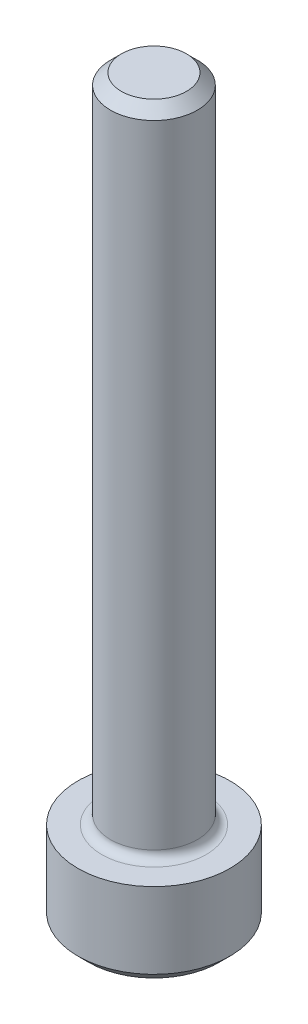
ISO-10303-21;
HEADER;
FILE_DESCRIPTION(('STEP AP214'),'2;1');
FILE_NAME('part.step','',(''),(''),'','','');
FILE_SCHEMA(('AUTOMOTIVE_DESIGN { 1 0 10303 214 1 1 1 1 }'));
ENDSEC;
DATA;
#1=APPLICATION_CONTEXT('core data for automotive mechanical design processes');
#2=APPLICATION_PROTOCOL_DEFINITION('international standard','automotive_design',2000,#1);
#3=PRODUCT_CONTEXT('',#1,'mechanical');
#4=PRODUCT('Part','Part','',(#3));
#5=PRODUCT_RELATED_PRODUCT_CATEGORY('part','',(#4));
#6=PRODUCT_DEFINITION_FORMATION('','',#4);
#7=PRODUCT_DEFINITION_CONTEXT('part definition',#1,'design');
#8=PRODUCT_DEFINITION('design','',#6,#7);
#9=PRODUCT_DEFINITION_SHAPE('','',#8);
#10=(LENGTH_UNIT() NAMED_UNIT(*) SI_UNIT(.MILLI.,.METRE.));
#11=(NAMED_UNIT(*) PLANE_ANGLE_UNIT() SI_UNIT($,.RADIAN.));
#12=(NAMED_UNIT(*) SI_UNIT($,.STERADIAN.) SOLID_ANGLE_UNIT());
#13=UNCERTAINTY_MEASURE_WITH_UNIT(LENGTH_MEASURE(1.E-05),#10,'distance_accuracy_value','');
#14=(GEOMETRIC_REPRESENTATION_CONTEXT(3) GLOBAL_UNCERTAINTY_ASSIGNED_CONTEXT((#13)) GLOBAL_UNIT_ASSIGNED_CONTEXT((#10,
#11,#12)) REPRESENTATION_CONTEXT('',''));
#15=CARTESIAN_POINT('',(0.,0.,0.));
#16=DIRECTION('',(0.,0.,1.));
#17=DIRECTION('',(1.,0.,0.));
#18=AXIS2_PLACEMENT_3D('',#15,#16,#17);
#19=CARTESIAN_POINT('',(0.,30.,0.));
#20=DIRECTION('',(0.,-1.,0.));
#21=DIRECTION('',(0.,0.,-1.));
#22=AXIS2_PLACEMENT_3D('',#19,#20,#21);
#23=CYLINDRICAL_SURFACE('',#22,2.);
#24=CARTESIAN_POINT('',(0.,29.5,0.));
#25=DIRECTION('',(0.,1.,0.));
#26=DIRECTION('',(0.,0.,1.));
#27=AXIS2_PLACEMENT_3D('',#24,#25,#26);
#28=CIRCLE('',#27,2.);
#29=CARTESIAN_POINT('',(0.,29.5,2.));
#30=VERTEX_POINT('',#29);
#31=EDGE_CURVE('E11',#30,#30,#28,.F.);
#32=ORIENTED_EDGE('',*,*,#31,.T.);
#33=EDGE_LOOP('',(#32));
#34=FACE_BOUND('',#33,.T.);
#35=CARTESIAN_POINT('',(0.,0.400000000000001,0.));
#36=DIRECTION('',(0.,1.,0.));
#37=DIRECTION('',(0.,0.,1.));
#38=AXIS2_PLACEMENT_3D('',#35,#36,#37);
#39=CIRCLE('',#38,2.);
#40=CARTESIAN_POINT('',(0.,0.400000000000001,2.));
#41=VERTEX_POINT('',#40);
#42=EDGE_CURVE('E143',#41,#41,#39,.T.);
#43=ORIENTED_EDGE('',*,*,#42,.T.);
#44=EDGE_LOOP('',(#43));
#45=FACE_BOUND('',#44,.T.);
#46=ADVANCED_FACE('F33',(#34,#45),#23,.T.);
#47=CARTESIAN_POINT('',(0.,30.,0.));
#48=DIRECTION('',(0.,1.,0.));
#49=DIRECTION('',(0.,0.,1.));
#50=AXIS2_PLACEMENT_3D('',#47,#48,#49);
#51=PLANE('',#50);
#52=CARTESIAN_POINT('',(0.,30.,0.));
#53=DIRECTION('',(0.,1.,0.));
#54=DIRECTION('',(0.,0.,1.));
#55=AXIS2_PLACEMENT_3D('',#52,#53,#54);
#56=CIRCLE('',#55,1.49999999999999);
#57=CARTESIAN_POINT('',(0.,30.,1.49999999999999));
#58=VERTEX_POINT('',#57);
#59=EDGE_CURVE('E41',#58,#58,#56,.T.);
#60=ORIENTED_EDGE('',*,*,#59,.T.);
#61=EDGE_LOOP('',(#60));
#62=FACE_BOUND('',#61,.T.);
#63=ADVANCED_FACE('F157',(#62),#51,.T.);
#64=CARTESIAN_POINT('',(0.,-4.,0.));
#65=DIRECTION('',(0.,1.,0.));
#66=DIRECTION('',(0.,0.,1.));
#67=AXIS2_PLACEMENT_3D('',#64,#65,#66);
#68=CYLINDRICAL_SURFACE('',#67,3.5);
#69=CARTESIAN_POINT('',(0.,-3.5,0.));
#70=DIRECTION('',(0.,1.,0.));
#71=DIRECTION('',(0.,0.,1.));
#72=AXIS2_PLACEMENT_3D('',#69,#70,#71);
#73=CIRCLE('',#72,3.5);
#74=CARTESIAN_POINT('',(0.,-3.5,3.5));
#75=VERTEX_POINT('',#74);
#76=EDGE_CURVE('E149',#75,#75,#73,.T.);
#77=ORIENTED_EDGE('',*,*,#76,.T.);
#78=EDGE_LOOP('',(#77));
#79=FACE_BOUND('',#78,.T.);
#80=CARTESIAN_POINT('',(0.,0.,0.));
#81=DIRECTION('',(0.,1.,0.));
#82=DIRECTION('',(0.,0.,1.));
#83=AXIS2_PLACEMENT_3D('',#80,#81,#82);
#84=CIRCLE('',#83,3.5);
#85=CARTESIAN_POINT('',(0.,0.,3.5));
#86=VERTEX_POINT('',#85);
#87=EDGE_CURVE('E135',#86,#86,#84,.T.);
#88=ORIENTED_EDGE('',*,*,#87,.F.);
#89=EDGE_LOOP('',(#88));
#90=FACE_BOUND('',#89,.T.);
#91=ADVANCED_FACE('F178',(#79,#90),#68,.T.);
#92=CARTESIAN_POINT('',(0.,-4.,0.));
#93=DIRECTION('',(0.,1.,0.));
#94=DIRECTION('',(0.,0.,1.));
#95=AXIS2_PLACEMENT_3D('',#92,#93,#94);
#96=PLANE('',#95);
#97=DIRECTION('',(-0.866025403784439,0.,-0.5));
#98=VECTOR('',#97,1.);
#99=CARTESIAN_POINT('',(0.,-4.,1.73205080756888));
#100=LINE('',#99,#98);
#101=CARTESIAN_POINT('',(0.,-4.,1.73205080756888));
#102=VERTEX_POINT('',#101);
#103=CARTESIAN_POINT('',(-1.5,-4.,0.866025403784438));
#104=VERTEX_POINT('',#103);
#105=EDGE_CURVE('E122',#102,#104,#100,.T.);
#106=ORIENTED_EDGE('',*,*,#105,.F.);
#107=DIRECTION('',(-0.866025403784439,0.,0.5));
#108=VECTOR('',#107,1.);
#109=CARTESIAN_POINT('',(1.5,-4.,0.866025403784439));
#110=LINE('',#109,#108);
#111=CARTESIAN_POINT('',(1.5,-4.,0.866025403784439));
#112=VERTEX_POINT('',#111);
#113=EDGE_CURVE('E48',#112,#102,#110,.T.);
#114=ORIENTED_EDGE('',*,*,#113,.F.);
#115=DIRECTION('',(0.,0.,1.));
#116=VECTOR('',#115,1.);
#117=CARTESIAN_POINT('',(1.5,-4.,-0.866025403784439));
#118=LINE('',#117,#116);
#119=CARTESIAN_POINT('',(1.5,-4.,-0.866025403784439));
#120=VERTEX_POINT('',#119);
#121=EDGE_CURVE('E131',#120,#112,#118,.T.);
#122=ORIENTED_EDGE('',*,*,#121,.F.);
#123=DIRECTION('',(0.866025403784439,0.,0.5));
#124=VECTOR('',#123,1.);
#125=CARTESIAN_POINT('',(0.,-4.,-1.73205080756888));
#126=LINE('',#125,#124);
#127=CARTESIAN_POINT('',(0.,-4.,-1.73205080756888));
#128=VERTEX_POINT('',#127);
#129=EDGE_CURVE('E129',#128,#120,#126,.T.);
#130=ORIENTED_EDGE('',*,*,#129,.F.);
#131=DIRECTION('',(0.866025403784439,0.,-0.5));
#132=VECTOR('',#131,1.);
#133=CARTESIAN_POINT('',(-1.5,-4.,-0.866025403784439));
#134=LINE('',#133,#132);
#135=CARTESIAN_POINT('',(-1.5,-4.,-0.866025403784439));
#136=VERTEX_POINT('',#135);
#137=EDGE_CURVE('E96',#136,#128,#134,.T.);
#138=ORIENTED_EDGE('',*,*,#137,.F.);
#139=DIRECTION('',(0.,0.,-1.));
#140=VECTOR('',#139,1.);
#141=CARTESIAN_POINT('',(-1.5,-4.,0.866025403784438));
#142=LINE('',#141,#140);
#143=EDGE_CURVE('E125',#104,#136,#142,.T.);
#144=ORIENTED_EDGE('',*,*,#143,.F.);
#145=EDGE_LOOP('',(#106,#114,#122,#130,#138,#144));
#146=FACE_BOUND('',#145,.T.);
#147=CARTESIAN_POINT('',(0.,-4.,0.));
#148=DIRECTION('',(0.,1.,0.));
#149=DIRECTION('',(0.,0.,1.));
#150=AXIS2_PLACEMENT_3D('',#147,#148,#149);
#151=CIRCLE('',#150,3.);
#152=CARTESIAN_POINT('',(0.,-4.,3.));
#153=VERTEX_POINT('',#152);
#154=EDGE_CURVE('E152',#153,#153,#151,.F.);
#155=ORIENTED_EDGE('',*,*,#154,.T.);
#156=EDGE_LOOP('',(#155));
#157=FACE_BOUND('',#156,.T.);
#158=ADVANCED_FACE('F189',(#146,#157),#96,.F.);
#159=CARTESIAN_POINT('',(0.,0.,0.));
#160=DIRECTION('',(0.,1.,0.));
#161=DIRECTION('',(0.,0.,1.));
#162=AXIS2_PLACEMENT_3D('',#159,#160,#161);
#163=PLANE('',#162);
#164=CARTESIAN_POINT('',(0.,0.,0.));
#165=DIRECTION('',(0.,1.,0.));
#166=DIRECTION('',(0.,0.,1.));
#167=AXIS2_PLACEMENT_3D('',#164,#165,#166);
#168=CIRCLE('',#167,2.4);
#169=CARTESIAN_POINT('',(0.,0.,2.4));
#170=VERTEX_POINT('',#169);
#171=EDGE_CURVE('E146',#170,#170,#168,.F.);
#172=ORIENTED_EDGE('',*,*,#171,.T.);
#173=EDGE_LOOP('',(#172));
#174=FACE_BOUND('',#173,.T.);
#175=ORIENTED_EDGE('',*,*,#87,.T.);
#176=EDGE_LOOP('',(#175));
#177=FACE_BOUND('',#176,.T.);
#178=ADVANCED_FACE('F184',(#174,#177),#163,.T.);
#179=CARTESIAN_POINT('',(0.,0.400000000000001,0.));
#180=DIRECTION('',(0.,1.,0.));
#181=DIRECTION('',(0.,0.,1.));
#182=AXIS2_PLACEMENT_3D('',#179,#180,#181);
#183=TOROIDAL_SURFACE('',#182,2.4,0.4);
#184=ORIENTED_EDGE('',*,*,#171,.F.);
#185=EDGE_LOOP('',(#184));
#186=FACE_BOUND('',#185,.T.);
#187=ORIENTED_EDGE('',*,*,#42,.F.);
#188=EDGE_LOOP('',(#187));
#189=FACE_BOUND('',#188,.T.);
#190=ADVANCED_FACE('F169',(#186,#189),#183,.F.);
#191=CARTESIAN_POINT('',(0.,-3.5,0.));
#192=DIRECTION('',(0.,1.,0.));
#193=DIRECTION('',(0.,0.,1.));
#194=AXIS2_PLACEMENT_3D('',#191,#192,#193);
#195=CONICAL_SURFACE('',#194,3.5,0.78539816339745);
#196=ORIENTED_EDGE('',*,*,#154,.F.);
#197=EDGE_LOOP('',(#196));
#198=FACE_BOUND('',#197,.T.);
#199=ORIENTED_EDGE('',*,*,#76,.F.);
#200=EDGE_LOOP('',(#199));
#201=FACE_BOUND('',#200,.T.);
#202=ADVANCED_FACE('F161',(#198,#201),#195,.T.);
#203=CARTESIAN_POINT('',(0.,30.,0.));
#204=DIRECTION('',(0.,-1.,0.));
#205=DIRECTION('',(0.,0.,-1.));
#206=AXIS2_PLACEMENT_3D('',#203,#204,#205);
#207=CONICAL_SURFACE('',#206,1.49999999999999,0.785398163397447);
#208=ORIENTED_EDGE('',*,*,#31,.F.);
#209=EDGE_LOOP('',(#208));
#210=FACE_BOUND('',#209,.T.);
#211=ORIENTED_EDGE('',*,*,#59,.F.);
#212=EDGE_LOOP('',(#211));
#213=FACE_BOUND('',#212,.T.);
#214=ADVANCED_FACE('F35',(#210,#213),#207,.T.);
#215=CARTESIAN_POINT('',(1.5,-1.5,0.866025403784439));
#216=DIRECTION('',(0.5,0.,0.866025403784439));
#217=DIRECTION('',(0.866025403784439,0.,-0.5));
#218=AXIS2_PLACEMENT_3D('',#215,#216,#217);
#219=PLANE('',#218);
#220=ORIENTED_EDGE('',*,*,#113,.T.);
#221=DIRECTION('',(0.,-1.,0.));
#222=VECTOR('',#221,1.);
#223=CARTESIAN_POINT('',(0.,-1.5,1.73205080756888));
#224=LINE('',#223,#222);
#225=CARTESIAN_POINT('',(0.,-1.5,1.73205080756888));
#226=VERTEX_POINT('',#225);
#227=EDGE_CURVE('E78',#226,#102,#224,.T.);
#228=ORIENTED_EDGE('',*,*,#227,.F.);
#229=DIRECTION('',(-0.866025403784439,0.,0.5));
#230=VECTOR('',#229,1.);
#231=CARTESIAN_POINT('',(1.5,-1.5,0.866025403784439));
#232=LINE('',#231,#230);
#233=CARTESIAN_POINT('',(1.5,-1.5,0.866025403784439));
#234=VERTEX_POINT('',#233);
#235=EDGE_CURVE('E133',#234,#226,#232,.T.);
#236=ORIENTED_EDGE('',*,*,#235,.F.);
#237=DIRECTION('',(0.,-1.,0.));
#238=VECTOR('',#237,1.);
#239=CARTESIAN_POINT('',(1.5,-1.5,0.866025403784439));
#240=LINE('',#239,#238);
#241=EDGE_CURVE('E56',#234,#112,#240,.T.);
#242=ORIENTED_EDGE('',*,*,#241,.T.);
#243=EDGE_LOOP('',(#220,#228,#236,#242));
#244=FACE_BOUND('',#243,.T.);
#245=ADVANCED_FACE('F160',(#244),#219,.F.);
#246=CARTESIAN_POINT('',(1.5,-1.5,-0.866025403784439));
#247=DIRECTION('',(1.,0.,0.));
#248=DIRECTION('',(0.,0.,-1.));
#249=AXIS2_PLACEMENT_3D('',#246,#247,#248);
#250=PLANE('',#249);
#251=ORIENTED_EDGE('',*,*,#121,.T.);
#252=ORIENTED_EDGE('',*,*,#241,.F.);
#253=DIRECTION('',(0.,0.,1.));
#254=VECTOR('',#253,1.);
#255=CARTESIAN_POINT('',(1.5,-1.5,-0.866025403784439));
#256=LINE('',#255,#254);
#257=CARTESIAN_POINT('',(1.5,-1.5,-0.866025403784439));
#258=VERTEX_POINT('',#257);
#259=EDGE_CURVE('E108',#258,#234,#256,.T.);
#260=ORIENTED_EDGE('',*,*,#259,.F.);
#261=DIRECTION('',(0.,-1.,0.));
#262=VECTOR('',#261,1.);
#263=CARTESIAN_POINT('',(1.5,-1.5,-0.866025403784439));
#264=LINE('',#263,#262);
#265=EDGE_CURVE('E100',#258,#120,#264,.T.);
#266=ORIENTED_EDGE('',*,*,#265,.T.);
#267=EDGE_LOOP('',(#251,#252,#260,#266));
#268=FACE_BOUND('',#267,.T.);
#269=ADVANCED_FACE('F167',(#268),#250,.F.);
#270=CARTESIAN_POINT('',(0.,-1.5,-1.73205080756888));
#271=DIRECTION('',(0.5,0.,-0.866025403784439));
#272=DIRECTION('',(-0.866025403784439,0.,-0.5));
#273=AXIS2_PLACEMENT_3D('',#270,#271,#272);
#274=PLANE('',#273);
#275=ORIENTED_EDGE('',*,*,#129,.T.);
#276=ORIENTED_EDGE('',*,*,#265,.F.);
#277=DIRECTION('',(0.866025403784439,0.,0.5));
#278=VECTOR('',#277,1.);
#279=CARTESIAN_POINT('',(0.,-1.5,-1.73205080756888));
#280=LINE('',#279,#278);
#281=CARTESIAN_POINT('',(0.,-1.5,-1.73205080756888));
#282=VERTEX_POINT('',#281);
#283=EDGE_CURVE('E104',#282,#258,#280,.T.);
#284=ORIENTED_EDGE('',*,*,#283,.F.);
#285=DIRECTION('',(0.,-1.,0.));
#286=VECTOR('',#285,1.);
#287=CARTESIAN_POINT('',(0.,-1.5,-1.73205080756888));
#288=LINE('',#287,#286);
#289=EDGE_CURVE('E89',#282,#128,#288,.T.);
#290=ORIENTED_EDGE('',*,*,#289,.T.);
#291=EDGE_LOOP('',(#275,#276,#284,#290));
#292=FACE_BOUND('',#291,.T.);
#293=ADVANCED_FACE('F105',(#292),#274,.F.);
#294=CARTESIAN_POINT('',(-1.5,-1.5,-0.866025403784439));
#295=DIRECTION('',(-0.5,0.,-0.866025403784439));
#296=DIRECTION('',(-0.866025403784439,0.,0.5));
#297=AXIS2_PLACEMENT_3D('',#294,#295,#296);
#298=PLANE('',#297);
#299=ORIENTED_EDGE('',*,*,#137,.T.);
#300=ORIENTED_EDGE('',*,*,#289,.F.);
#301=DIRECTION('',(0.866025403784439,0.,-0.5));
#302=VECTOR('',#301,1.);
#303=CARTESIAN_POINT('',(-1.5,-1.5,-0.866025403784439));
#304=LINE('',#303,#302);
#305=CARTESIAN_POINT('',(-1.5,-1.5,-0.866025403784439));
#306=VERTEX_POINT('',#305);
#307=EDGE_CURVE('E93',#306,#282,#304,.T.);
#308=ORIENTED_EDGE('',*,*,#307,.F.);
#309=DIRECTION('',(0.,-1.,0.));
#310=VECTOR('',#309,1.);
#311=CARTESIAN_POINT('',(-1.5,-1.5,-0.866025403784439));
#312=LINE('',#311,#310);
#313=EDGE_CURVE('E101',#306,#136,#312,.T.);
#314=ORIENTED_EDGE('',*,*,#313,.T.);
#315=EDGE_LOOP('',(#299,#300,#308,#314));
#316=FACE_BOUND('',#315,.T.);
#317=ADVANCED_FACE('F91',(#316),#298,.F.);
#318=CARTESIAN_POINT('',(-1.5,-1.5,0.866025403784438));
#319=DIRECTION('',(-1.,0.,0.));
#320=DIRECTION('',(0.,0.,1.));
#321=AXIS2_PLACEMENT_3D('',#318,#319,#320);
#322=PLANE('',#321);
#323=ORIENTED_EDGE('',*,*,#143,.T.);
#324=ORIENTED_EDGE('',*,*,#313,.F.);
#325=DIRECTION('',(0.,0.,-1.));
#326=VECTOR('',#325,1.);
#327=CARTESIAN_POINT('',(-1.5,-1.5,0.866025403784438));
#328=LINE('',#327,#326);
#329=CARTESIAN_POINT('',(-1.5,-1.5,0.866025403784438));
#330=VERTEX_POINT('',#329);
#331=EDGE_CURVE('E114',#330,#306,#328,.T.);
#332=ORIENTED_EDGE('',*,*,#331,.F.);
#333=DIRECTION('',(0.,-1.,0.));
#334=VECTOR('',#333,1.);
#335=CARTESIAN_POINT('',(-1.5,-1.5,0.866025403784438));
#336=LINE('',#335,#334);
#337=EDGE_CURVE('E138',#330,#104,#336,.T.);
#338=ORIENTED_EDGE('',*,*,#337,.T.);
#339=EDGE_LOOP('',(#323,#324,#332,#338));
#340=FACE_BOUND('',#339,.T.);
#341=ADVANCED_FACE('F209',(#340),#322,.F.);
#342=CARTESIAN_POINT('',(0.,-1.5,1.73205080756888));
#343=DIRECTION('',(-0.5,0.,0.866025403784439));
#344=DIRECTION('',(0.866025403784439,0.,0.5));
#345=AXIS2_PLACEMENT_3D('',#342,#343,#344);
#346=PLANE('',#345);
#347=ORIENTED_EDGE('',*,*,#105,.T.);
#348=ORIENTED_EDGE('',*,*,#337,.F.);
#349=DIRECTION('',(-0.866025403784439,0.,-0.5));
#350=VECTOR('',#349,1.);
#351=CARTESIAN_POINT('',(0.,-1.5,1.73205080756888));
#352=LINE('',#351,#350);
#353=EDGE_CURVE('E116',#226,#330,#352,.T.);
#354=ORIENTED_EDGE('',*,*,#353,.F.);
#355=ORIENTED_EDGE('',*,*,#227,.T.);
#356=EDGE_LOOP('',(#347,#348,#354,#355));
#357=FACE_BOUND('',#356,.T.);
#358=ADVANCED_FACE('F206',(#357),#346,.F.);
#359=CARTESIAN_POINT('',(0.,-1.5,0.));
#360=DIRECTION('',(0.,-1.,0.));
#361=DIRECTION('',(0.,0.,-1.));
#362=AXIS2_PLACEMENT_3D('',#359,#360,#361);
#363=PLANE('',#362);
#364=ORIENTED_EDGE('',*,*,#235,.T.);
#365=ORIENTED_EDGE('',*,*,#353,.T.);
#366=ORIENTED_EDGE('',*,*,#331,.T.);
#367=ORIENTED_EDGE('',*,*,#307,.T.);
#368=ORIENTED_EDGE('',*,*,#283,.T.);
#369=ORIENTED_EDGE('',*,*,#259,.T.);
#370=EDGE_LOOP('',(#364,#365,#366,#367,#368,#369));
#371=FACE_BOUND('',#370,.T.);
#372=ADVANCED_FACE('F111',(#371),#363,.T.);
#373=CLOSED_SHELL('',(#46,#63,#91,#158,#178,#190,#202,#214,#245,#269,#293,#317,#341,#358,#372));
#374=MANIFOLD_SOLID_BREP('B2',#373);
#375=ADVANCED_BREP_SHAPE_REPRESENTATION('',(#18,#374),#14);
#376=SHAPE_DEFINITION_REPRESENTATION(#9,#375);
ENDSEC;
END-ISO-10303-21;
